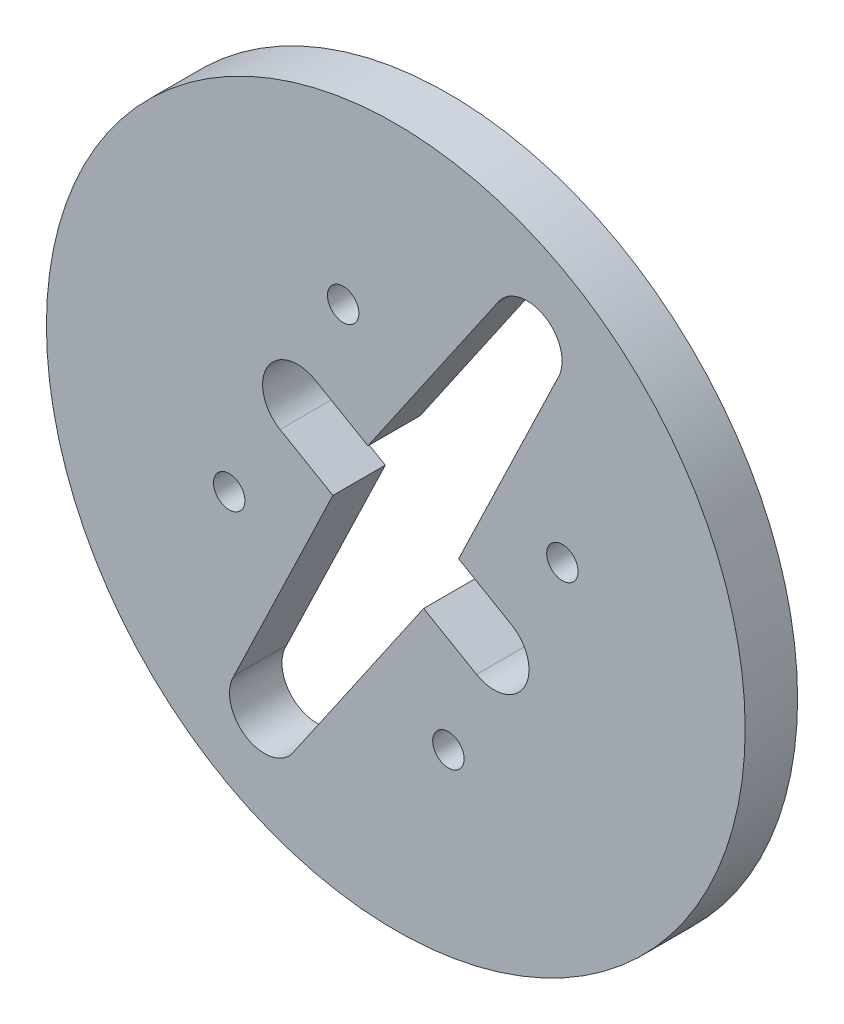
ISO-10303-21;
HEADER;
FILE_DESCRIPTION(('STEP AP214'),'2;1');
FILE_NAME('part.step','',(''),(''),'','','');
FILE_SCHEMA(('AUTOMOTIVE_DESIGN { 1 0 10303 214 1 1 1 1 }'));
ENDSEC;
DATA;
#1=APPLICATION_CONTEXT('core data for automotive mechanical design processes');
#2=APPLICATION_PROTOCOL_DEFINITION('international standard','automotive_design',2000,#1);
#3=PRODUCT_CONTEXT('',#1,'mechanical');
#4=PRODUCT('Part','Part','',(#3));
#5=PRODUCT_RELATED_PRODUCT_CATEGORY('part','',(#4));
#6=PRODUCT_DEFINITION_FORMATION('','',#4);
#7=PRODUCT_DEFINITION_CONTEXT('part definition',#1,'design');
#8=PRODUCT_DEFINITION('design','',#6,#7);
#9=PRODUCT_DEFINITION_SHAPE('','',#8);
#10=(LENGTH_UNIT() NAMED_UNIT(*) SI_UNIT(.MILLI.,.METRE.));
#11=(NAMED_UNIT(*) PLANE_ANGLE_UNIT() SI_UNIT($,.RADIAN.));
#12=(NAMED_UNIT(*) SI_UNIT($,.STERADIAN.) SOLID_ANGLE_UNIT());
#13=UNCERTAINTY_MEASURE_WITH_UNIT(LENGTH_MEASURE(1.E-05),#10,'distance_accuracy_value','');
#14=(GEOMETRIC_REPRESENTATION_CONTEXT(3) GLOBAL_UNCERTAINTY_ASSIGNED_CONTEXT((#13)) GLOBAL_UNIT_ASSIGNED_CONTEXT((#10,
#11,#12)) REPRESENTATION_CONTEXT('',''));
#15=CARTESIAN_POINT('',(0.,0.,0.));
#16=DIRECTION('',(0.,0.,1.));
#17=DIRECTION('',(1.,0.,0.));
#18=AXIS2_PLACEMENT_3D('',#15,#16,#17);
#19=CARTESIAN_POINT('',(2.59213585311026,-1.7801873533811,3.));
#20=DIRECTION('',(0.824324794546752,-0.566117154920654,0.));
#21=DIRECTION('',(0.566117154920654,0.824324794546752,0.));
#22=AXIS2_PLACEMENT_3D('',#19,#20,#21);
#23=PLANE('',#22);
#24=DIRECTION('',(-0.566117154920654,-0.824324794546752,0.));
#25=VECTOR('',#24,1.);
#26=CARTESIAN_POINT('',(2.59213585311026,-1.7801873533811,0.));
#27=LINE('',#26,#25);
#28=CARTESIAN_POINT('',(1.5934941670672,-3.23431234415027,0.));
#29=VERTEX_POINT('',#28);
#30=CARTESIAN_POINT('',(-5.78777046890322,-13.982192710705,0.));
#31=VERTEX_POINT('',#30);
#32=EDGE_CURVE('E160',#29,#31,#27,.T.);
#33=ORIENTED_EDGE('',*,*,#32,.T.);
#34=DIRECTION('',(0.,0.,-1.));
#35=VECTOR('',#34,1.);
#36=CARTESIAN_POINT('',(-5.78777046890322,-13.982192710705,3.));
#37=LINE('',#36,#35);
#38=CARTESIAN_POINT('',(-5.78777046890322,-13.982192710705,3.));
#39=VERTEX_POINT('',#38);
#40=EDGE_CURVE('E11',#39,#31,#37,.T.);
#41=ORIENTED_EDGE('',*,*,#40,.F.);
#42=DIRECTION('',(-0.566117154920654,-0.824324794546752,0.));
#43=VECTOR('',#42,1.);
#44=CARTESIAN_POINT('',(2.59213585311026,-1.7801873533811,3.));
#45=LINE('',#44,#43);
#46=CARTESIAN_POINT('',(1.5934941670672,-3.23431234415027,3.));
#47=VERTEX_POINT('',#46);
#48=EDGE_CURVE('E225',#47,#39,#45,.T.);
#49=ORIENTED_EDGE('',*,*,#48,.F.);
#50=DIRECTION('',(0.,0.,-1.));
#51=VECTOR('',#50,1.);
#52=CARTESIAN_POINT('',(1.5934941670672,-3.23431234415027,3.));
#53=LINE('',#52,#51);
#54=EDGE_CURVE('E49',#47,#29,#53,.T.);
#55=ORIENTED_EDGE('',*,*,#54,.T.);
#56=EDGE_LOOP('',(#33,#41,#49,#55));
#57=FACE_BOUND('',#56,.T.);
#58=ADVANCED_FACE('F32',(#57),#23,.F.);
#59=CARTESIAN_POINT('',(-7.51840234421123,-12.9797390648102,3.));
#60=DIRECTION('',(0.,0.,-1.));
#61=DIRECTION('',(-1.,0.,0.));
#62=AXIS2_PLACEMENT_3D('',#59,#60,#61);
#63=CYLINDRICAL_SURFACE('',#62,2.);
#64=CARTESIAN_POINT('',(-7.51840234421123,-12.9797390648102,0.));
#65=DIRECTION('',(0.,0.,1.));
#66=DIRECTION('',(1.,0.,0.));
#67=AXIS2_PLACEMENT_3D('',#64,#65,#66);
#68=CIRCLE('',#67,2.);
#69=CARTESIAN_POINT('',(-9.24903421951926,-11.9772854189153,0.));
#70=VERTEX_POINT('',#69);
#71=EDGE_CURVE('E163',#31,#70,#68,.F.);
#72=ORIENTED_EDGE('',*,*,#71,.T.);
#73=DIRECTION('',(0.,0.,-1.));
#74=VECTOR('',#73,1.);
#75=CARTESIAN_POINT('',(-9.24903421951926,-11.9772854189153,3.));
#76=LINE('',#75,#74);
#77=CARTESIAN_POINT('',(-9.24903421951926,-11.9772854189153,3.));
#78=VERTEX_POINT('',#77);
#79=EDGE_CURVE('E41',#78,#70,#76,.T.);
#80=ORIENTED_EDGE('',*,*,#79,.F.);
#81=CARTESIAN_POINT('',(-7.51840234421123,-12.9797390648102,3.));
#82=DIRECTION('',(0.,0.,1.));
#83=DIRECTION('',(1.,0.,0.));
#84=AXIS2_PLACEMENT_3D('',#81,#82,#83);
#85=CIRCLE('',#84,2.);
#86=EDGE_CURVE('E99',#39,#78,#85,.F.);
#87=ORIENTED_EDGE('',*,*,#86,.F.);
#88=ORIENTED_EDGE('',*,*,#40,.T.);
#89=EDGE_LOOP('',(#72,#80,#87,#88));
#90=FACE_BOUND('',#89,.T.);
#91=ADVANCED_FACE('F210',(#90),#63,.F.);
#92=CARTESIAN_POINT('',(-2.83390408535548,1.36279966580681,3.));
#93=DIRECTION('',(0.901209479481125,-0.433383749226202,0.));
#94=DIRECTION('',(0.433383749226202,0.901209479481125,0.));
#95=AXIS2_PLACEMENT_3D('',#92,#93,#94);
#96=PLANE('',#95);
#97=DIRECTION('',(-0.433383749226202,-0.901209479481125,0.));
#98=VECTOR('',#97,1.);
#99=CARTESIAN_POINT('',(-2.83390408535548,1.36279966580681,0.));
#100=LINE('',#99,#98);
#101=CARTESIAN_POINT('',(-3.59840145885687,-0.226951406465772,0.));
#102=VERTEX_POINT('',#101);
#103=EDGE_CURVE('E166',#102,#70,#100,.T.);
#104=ORIENTED_EDGE('',*,*,#103,.F.);
#105=DIRECTION('',(0.,0.,-1.));
#106=VECTOR('',#105,1.);
#107=CARTESIAN_POINT('',(-3.59840145885687,-0.226951406465772,3.));
#108=LINE('',#107,#106);
#109=CARTESIAN_POINT('',(-3.59840145885687,-0.226951406465772,3.));
#110=VERTEX_POINT('',#109);
#111=EDGE_CURVE('E203',#110,#102,#108,.T.);
#112=ORIENTED_EDGE('',*,*,#111,.F.);
#113=DIRECTION('',(-0.433383749226202,-0.901209479481125,0.));
#114=VECTOR('',#113,1.);
#115=CARTESIAN_POINT('',(-2.83390408535548,1.36279966580681,3.));
#116=LINE('',#115,#114);
#117=EDGE_CURVE('E209',#110,#78,#116,.T.);
#118=ORIENTED_EDGE('',*,*,#117,.T.);
#119=ORIENTED_EDGE('',*,*,#79,.T.);
#120=EDGE_LOOP('',(#104,#112,#118,#119));
#121=FACE_BOUND('',#120,.T.);
#122=ADVANCED_FACE('F207',(#121),#96,.T.);
#123=CARTESIAN_POINT('',(-1.00245364589483,-1.73063187530802,3.));
#124=DIRECTION('',(0.501226822947415,0.865315937654011,0.));
#125=DIRECTION('',(-0.865315937654011,0.501226822947416,0.));
#126=AXIS2_PLACEMENT_3D('',#123,#124,#125);
#127=PLANE('',#126);
#128=DIRECTION('',(0.865315937654011,-0.501226822947416,0.));
#129=VECTOR('',#128,1.);
#130=CARTESIAN_POINT('',(-1.00245364589483,-1.73063187530802,0.));
#131=LINE('',#130,#129);
#132=CARTESIAN_POINT('',(-6.6270072406459,1.52734247385018,0.));
#133=VERTEX_POINT('',#132);
#134=EDGE_CURVE('E169',#133,#102,#131,.T.);
#135=ORIENTED_EDGE('',*,*,#134,.F.);
#136=DIRECTION('',(0.,0.,-1.));
#137=VECTOR('',#136,1.);
#138=CARTESIAN_POINT('',(-6.6270072406459,1.52734247385018,3.));
#139=LINE('',#138,#137);
#140=CARTESIAN_POINT('',(-6.6270072406459,1.52734247385018,3.));
#141=VERTEX_POINT('',#140);
#142=EDGE_CURVE('E201',#141,#133,#139,.T.);
#143=ORIENTED_EDGE('',*,*,#142,.F.);
#144=DIRECTION('',(0.865315937654011,-0.501226822947416,0.));
#145=VECTOR('',#144,1.);
#146=CARTESIAN_POINT('',(-1.00245364589483,-1.73063187530802,3.));
#147=LINE('',#146,#145);
#148=EDGE_CURVE('E153',#141,#110,#147,.T.);
#149=ORIENTED_EDGE('',*,*,#148,.T.);
#150=ORIENTED_EDGE('',*,*,#111,.T.);
#151=EDGE_LOOP('',(#135,#143,#149,#150));
#152=FACE_BOUND('',#151,.T.);
#153=ADVANCED_FACE('F218',(#152),#127,.T.);
#154=CARTESIAN_POINT('',(-5.62455359475107,3.2579743491582,3.));
#155=DIRECTION('',(0.,0.,-1.));
#156=DIRECTION('',(-1.,0.,0.));
#157=AXIS2_PLACEMENT_3D('',#154,#155,#156);
#158=CYLINDRICAL_SURFACE('',#157,2.);
#159=CARTESIAN_POINT('',(-5.62455359475107,3.2579743491582,0.));
#160=DIRECTION('',(0.,0.,1.));
#161=DIRECTION('',(1.,0.,0.));
#162=AXIS2_PLACEMENT_3D('',#159,#160,#161);
#163=CIRCLE('',#162,2.);
#164=CARTESIAN_POINT('',(-4.62209994885624,4.98860622446622,0.));
#165=VERTEX_POINT('',#164);
#166=EDGE_CURVE('E172',#165,#133,#163,.T.);
#167=ORIENTED_EDGE('',*,*,#166,.F.);
#168=DIRECTION('',(0.,0.,-1.));
#169=VECTOR('',#168,1.);
#170=CARTESIAN_POINT('',(-4.62209994885624,4.98860622446622,3.));
#171=LINE('',#170,#169);
#172=CARTESIAN_POINT('',(-4.62209994885624,4.98860622446622,3.));
#173=VERTEX_POINT('',#172);
#174=EDGE_CURVE('E199',#173,#165,#171,.T.);
#175=ORIENTED_EDGE('',*,*,#174,.F.);
#176=CARTESIAN_POINT('',(-5.62455359475107,3.2579743491582,3.));
#177=DIRECTION('',(0.,0.,1.));
#178=DIRECTION('',(1.,0.,0.));
#179=AXIS2_PLACEMENT_3D('',#176,#177,#178);
#180=CIRCLE('',#179,2.);
#181=EDGE_CURVE('E224',#173,#141,#180,.T.);
#182=ORIENTED_EDGE('',*,*,#181,.T.);
#183=ORIENTED_EDGE('',*,*,#142,.T.);
#184=EDGE_LOOP('',(#167,#175,#182,#183));
#185=FACE_BOUND('',#184,.T.);
#186=ADVANCED_FACE('F307',(#185),#158,.F.);
#187=CARTESIAN_POINT('',(1.00245364589483,1.73063187530802,3.));
#188=DIRECTION('',(0.501226822947415,0.865315937654011,0.));
#189=DIRECTION('',(-0.865315937654011,0.501226822947416,0.));
#190=AXIS2_PLACEMENT_3D('',#187,#188,#189);
#191=PLANE('',#190);
#192=DIRECTION('',(0.865315937654011,-0.501226822947416,0.));
#193=VECTOR('',#192,1.);
#194=CARTESIAN_POINT('',(1.00245364589483,1.73063187530802,0.));
#195=LINE('',#194,#193);
#196=CARTESIAN_POINT('',(-1.5934941670672,3.23431234415027,0.));
#197=VERTEX_POINT('',#196);
#198=EDGE_CURVE('E176',#165,#197,#195,.T.);
#199=ORIENTED_EDGE('',*,*,#198,.T.);
#200=DIRECTION('',(0.,0.,-1.));
#201=VECTOR('',#200,1.);
#202=CARTESIAN_POINT('',(-1.5934941670672,3.23431234415027,3.));
#203=LINE('',#202,#201);
#204=CARTESIAN_POINT('',(-1.5934941670672,3.23431234415027,3.));
#205=VERTEX_POINT('',#204);
#206=EDGE_CURVE('E196',#205,#197,#203,.T.);
#207=ORIENTED_EDGE('',*,*,#206,.F.);
#208=DIRECTION('',(0.865315937654011,-0.501226822947416,0.));
#209=VECTOR('',#208,1.);
#210=CARTESIAN_POINT('',(1.00245364589483,1.73063187530802,3.));
#211=LINE('',#210,#209);
#212=EDGE_CURVE('E139',#173,#205,#211,.T.);
#213=ORIENTED_EDGE('',*,*,#212,.F.);
#214=ORIENTED_EDGE('',*,*,#174,.T.);
#215=EDGE_LOOP('',(#199,#207,#213,#214));
#216=FACE_BOUND('',#215,.T.);
#217=ADVANCED_FACE('F310',(#216),#191,.F.);
#218=CARTESIAN_POINT('',(-2.59213585311026,1.7801873533811,3.));
#219=DIRECTION('',(-0.824324794546752,0.566117154920654,0.));
#220=DIRECTION('',(-0.566117154920654,-0.824324794546752,0.));
#221=AXIS2_PLACEMENT_3D('',#218,#219,#220);
#222=PLANE('',#221);
#223=DIRECTION('',(0.566117154920654,0.824324794546752,0.));
#224=VECTOR('',#223,1.);
#225=CARTESIAN_POINT('',(-2.59213585311026,1.7801873533811,0.));
#226=LINE('',#225,#224);
#227=CARTESIAN_POINT('',(5.78777046890321,13.982192710705,0.));
#228=VERTEX_POINT('',#227);
#229=EDGE_CURVE('E178',#197,#228,#226,.T.);
#230=ORIENTED_EDGE('',*,*,#229,.T.);
#231=DIRECTION('',(0.,0.,-1.));
#232=VECTOR('',#231,1.);
#233=CARTESIAN_POINT('',(5.78777046890321,13.982192710705,3.));
#234=LINE('',#233,#232);
#235=CARTESIAN_POINT('',(5.78777046890321,13.982192710705,3.));
#236=VERTEX_POINT('',#235);
#237=EDGE_CURVE('E194',#236,#228,#234,.T.);
#238=ORIENTED_EDGE('',*,*,#237,.F.);
#239=DIRECTION('',(0.566117154920654,0.824324794546752,0.));
#240=VECTOR('',#239,1.);
#241=CARTESIAN_POINT('',(-2.59213585311026,1.7801873533811,3.));
#242=LINE('',#241,#240);
#243=EDGE_CURVE('E230',#205,#236,#242,.T.);
#244=ORIENTED_EDGE('',*,*,#243,.F.);
#245=ORIENTED_EDGE('',*,*,#206,.T.);
#246=EDGE_LOOP('',(#230,#238,#244,#245));
#247=FACE_BOUND('',#246,.T.);
#248=ADVANCED_FACE('F312',(#247),#222,.F.);
#249=CARTESIAN_POINT('',(7.51840234421123,12.9797390648102,3.));
#250=DIRECTION('',(0.,0.,-1.));
#251=DIRECTION('',(-1.,0.,0.));
#252=AXIS2_PLACEMENT_3D('',#249,#250,#251);
#253=CYLINDRICAL_SURFACE('',#252,2.);
#254=CARTESIAN_POINT('',(7.51840234421123,12.9797390648102,0.));
#255=DIRECTION('',(0.,0.,1.));
#256=DIRECTION('',(1.,0.,0.));
#257=AXIS2_PLACEMENT_3D('',#254,#255,#256);
#258=CIRCLE('',#257,2.);
#259=CARTESIAN_POINT('',(9.24903421951925,11.9772854189153,0.));
#260=VERTEX_POINT('',#259);
#261=EDGE_CURVE('E181',#260,#228,#258,.T.);
#262=ORIENTED_EDGE('',*,*,#261,.F.);
#263=DIRECTION('',(0.,0.,-1.));
#264=VECTOR('',#263,1.);
#265=CARTESIAN_POINT('',(9.24903421951925,11.9772854189153,3.));
#266=LINE('',#265,#264);
#267=CARTESIAN_POINT('',(9.24903421951925,11.9772854189153,3.));
#268=VERTEX_POINT('',#267);
#269=EDGE_CURVE('E192',#268,#260,#266,.T.);
#270=ORIENTED_EDGE('',*,*,#269,.F.);
#271=CARTESIAN_POINT('',(7.51840234421123,12.9797390648102,3.));
#272=DIRECTION('',(0.,0.,1.));
#273=DIRECTION('',(1.,0.,0.));
#274=AXIS2_PLACEMENT_3D('',#271,#272,#273);
#275=CIRCLE('',#274,2.);
#276=EDGE_CURVE('E231',#268,#236,#275,.T.);
#277=ORIENTED_EDGE('',*,*,#276,.T.);
#278=ORIENTED_EDGE('',*,*,#237,.T.);
#279=EDGE_LOOP('',(#262,#270,#277,#278));
#280=FACE_BOUND('',#279,.T.);
#281=ADVANCED_FACE('F315',(#280),#253,.F.);
#282=CARTESIAN_POINT('',(2.83390408535548,-1.36279966580681,3.));
#283=DIRECTION('',(-0.901209479481125,0.433383749226202,0.));
#284=DIRECTION('',(-0.433383749226202,-0.901209479481125,0.));
#285=AXIS2_PLACEMENT_3D('',#282,#283,#284);
#286=PLANE('',#285);
#287=DIRECTION('',(0.433383749226202,0.901209479481125,0.));
#288=VECTOR('',#287,1.);
#289=CARTESIAN_POINT('',(2.83390408535548,-1.36279966580681,0.));
#290=LINE('',#289,#288);
#291=CARTESIAN_POINT('',(3.59840145885686,0.226951406465775,0.));
#292=VERTEX_POINT('',#291);
#293=EDGE_CURVE('E184',#292,#260,#290,.T.);
#294=ORIENTED_EDGE('',*,*,#293,.F.);
#295=DIRECTION('',(0.,0.,-1.));
#296=VECTOR('',#295,1.);
#297=CARTESIAN_POINT('',(3.59840145885686,0.226951406465775,3.));
#298=LINE('',#297,#296);
#299=CARTESIAN_POINT('',(3.59840145885686,0.226951406465775,3.));
#300=VERTEX_POINT('',#299);
#301=EDGE_CURVE('E147',#300,#292,#298,.T.);
#302=ORIENTED_EDGE('',*,*,#301,.F.);
#303=DIRECTION('',(0.433383749226202,0.901209479481125,0.));
#304=VECTOR('',#303,1.);
#305=CARTESIAN_POINT('',(2.83390408535548,-1.36279966580681,3.));
#306=LINE('',#305,#304);
#307=EDGE_CURVE('E136',#300,#268,#306,.T.);
#308=ORIENTED_EDGE('',*,*,#307,.T.);
#309=ORIENTED_EDGE('',*,*,#269,.T.);
#310=EDGE_LOOP('',(#294,#302,#308,#309));
#311=FACE_BOUND('',#310,.T.);
#312=ADVANCED_FACE('F236',(#311),#286,.T.);
#313=CARTESIAN_POINT('',(6.6270072406459,-1.52734247385018,0.));
#314=VERTEX_POINT('',#313);
#315=EDGE_CURVE('E144',#292,#314,#195,.T.);
#316=ORIENTED_EDGE('',*,*,#315,.T.);
#317=DIRECTION('',(0.,0.,-1.));
#318=VECTOR('',#317,1.);
#319=CARTESIAN_POINT('',(6.6270072406459,-1.52734247385018,3.));
#320=LINE('',#319,#318);
#321=CARTESIAN_POINT('',(6.6270072406459,-1.52734247385018,3.));
#322=VERTEX_POINT('',#321);
#323=EDGE_CURVE('E141',#322,#314,#320,.T.);
#324=ORIENTED_EDGE('',*,*,#323,.F.);
#325=EDGE_CURVE('E128',#300,#322,#211,.T.);
#326=ORIENTED_EDGE('',*,*,#325,.F.);
#327=ORIENTED_EDGE('',*,*,#301,.T.);
#328=EDGE_LOOP('',(#316,#324,#326,#327));
#329=FACE_BOUND('',#328,.T.);
#330=ADVANCED_FACE('F142',(#329),#191,.F.);
#331=CARTESIAN_POINT('',(5.62455359475107,-3.2579743491582,3.));
#332=DIRECTION('',(0.,0.,-1.));
#333=DIRECTION('',(-1.,0.,0.));
#334=AXIS2_PLACEMENT_3D('',#331,#332,#333);
#335=CYLINDRICAL_SURFACE('',#334,2.);
#336=CARTESIAN_POINT('',(5.62455359475107,-3.2579743491582,0.));
#337=DIRECTION('',(0.,0.,1.));
#338=DIRECTION('',(1.,0.,0.));
#339=AXIS2_PLACEMENT_3D('',#336,#337,#338);
#340=CIRCLE('',#339,2.);
#341=CARTESIAN_POINT('',(4.62209994885624,-4.98860622446622,0.));
#342=VERTEX_POINT('',#341);
#343=EDGE_CURVE('E187',#342,#314,#340,.T.);
#344=ORIENTED_EDGE('',*,*,#343,.F.);
#345=DIRECTION('',(0.,0.,-1.));
#346=VECTOR('',#345,1.);
#347=CARTESIAN_POINT('',(4.62209994885624,-4.98860622446622,3.));
#348=LINE('',#347,#346);
#349=CARTESIAN_POINT('',(4.62209994885624,-4.98860622446622,3.));
#350=VERTEX_POINT('',#349);
#351=EDGE_CURVE('E87',#350,#342,#348,.T.);
#352=ORIENTED_EDGE('',*,*,#351,.F.);
#353=CARTESIAN_POINT('',(5.62455359475107,-3.2579743491582,3.));
#354=DIRECTION('',(0.,0.,1.));
#355=DIRECTION('',(1.,0.,0.));
#356=AXIS2_PLACEMENT_3D('',#353,#354,#355);
#357=CIRCLE('',#356,2.);
#358=EDGE_CURVE('E133',#350,#322,#357,.T.);
#359=ORIENTED_EDGE('',*,*,#358,.T.);
#360=ORIENTED_EDGE('',*,*,#323,.T.);
#361=EDGE_LOOP('',(#344,#352,#359,#360));
#362=FACE_BOUND('',#361,.T.);
#363=ADVANCED_FACE('F149',(#362),#335,.F.);
#364=CARTESIAN_POINT('',(0.,0.,3.));
#365=DIRECTION('',(0.,0.,-1.));
#366=DIRECTION('',(-1.,0.,0.));
#367=AXIS2_PLACEMENT_3D('',#364,#365,#366);
#368=CYLINDRICAL_SURFACE('',#367,20.);
#369=CARTESIAN_POINT('',(0.,0.,3.));
#370=DIRECTION('',(0.,0.,1.));
#371=DIRECTION('',(1.,0.,0.));
#372=AXIS2_PLACEMENT_3D('',#369,#370,#371);
#373=CIRCLE('',#372,20.);
#374=CARTESIAN_POINT('',(20.,0.,3.));
#375=VERTEX_POINT('',#374);
#376=EDGE_CURVE('E239',#375,#375,#373,.T.);
#377=ORIENTED_EDGE('',*,*,#376,.F.);
#378=EDGE_LOOP('',(#377));
#379=FACE_BOUND('',#378,.T.);
#380=CARTESIAN_POINT('',(0.,0.,0.));
#381=DIRECTION('',(0.,0.,1.));
#382=DIRECTION('',(1.,0.,0.));
#383=AXIS2_PLACEMENT_3D('',#380,#381,#382);
#384=CIRCLE('',#383,20.);
#385=CARTESIAN_POINT('',(20.,0.,0.));
#386=VERTEX_POINT('',#385);
#387=EDGE_CURVE('E157',#386,#386,#384,.T.);
#388=ORIENTED_EDGE('',*,*,#387,.T.);
#389=EDGE_LOOP('',(#388));
#390=FACE_BOUND('',#389,.T.);
#391=ADVANCED_FACE('F34',(#379,#390),#368,.T.);
#392=EDGE_CURVE('E173',#29,#342,#131,.T.);
#393=ORIENTED_EDGE('',*,*,#392,.F.);
#394=ORIENTED_EDGE('',*,*,#54,.F.);
#395=EDGE_CURVE('E150',#47,#350,#147,.T.);
#396=ORIENTED_EDGE('',*,*,#395,.T.);
#397=ORIENTED_EDGE('',*,*,#351,.T.);
#398=EDGE_LOOP('',(#393,#394,#396,#397));
#399=FACE_BOUND('',#398,.T.);
#400=ADVANCED_FACE('F291',(#399),#127,.T.);
#401=CARTESIAN_POINT('',(0.,0.,3.));
#402=DIRECTION('',(0.,0.,1.));
#403=DIRECTION('',(1.,0.,0.));
#404=AXIS2_PLACEMENT_3D('',#401,#402,#403);
#405=PLANE('',#404);
#406=CARTESIAN_POINT('',(3.0112228113094,-9.53585534604263,3.));
#407=DIRECTION('',(0.,0.,-1.));
#408=DIRECTION('',(-1.,0.,0.));
#409=AXIS2_PLACEMENT_3D('',#406,#407,#408);
#410=CIRCLE('',#409,0.9);
#411=CARTESIAN_POINT('',(2.1112228113094,-9.53585534604263,3.));
#412=VERTEX_POINT('',#411);
#413=EDGE_CURVE('E161',#412,#412,#410,.T.);
#414=ORIENTED_EDGE('',*,*,#413,.T.);
#415=EDGE_LOOP('',(#414));
#416=FACE_BOUND('',#415,.T.);
#417=CARTESIAN_POINT('',(9.53585534604263,3.0112228113094,3.));
#418=DIRECTION('',(0.,0.,-1.));
#419=DIRECTION('',(-1.,0.,0.));
#420=AXIS2_PLACEMENT_3D('',#417,#418,#419);
#421=CIRCLE('',#420,0.9);
#422=CARTESIAN_POINT('',(8.63585534604264,3.0112228113094,3.));
#423=VERTEX_POINT('',#422);
#424=EDGE_CURVE('E260',#423,#423,#421,.T.);
#425=ORIENTED_EDGE('',*,*,#424,.T.);
#426=EDGE_LOOP('',(#425));
#427=FACE_BOUND('',#426,.T.);
#428=CARTESIAN_POINT('',(-3.0112228113094,9.53585534604263,3.));
#429=DIRECTION('',(0.,0.,-1.));
#430=DIRECTION('',(-1.,0.,0.));
#431=AXIS2_PLACEMENT_3D('',#428,#429,#430);
#432=CIRCLE('',#431,0.9);
#433=CARTESIAN_POINT('',(-3.9112228113094,9.53585534604263,3.));
#434=VERTEX_POINT('',#433);
#435=EDGE_CURVE('E254',#434,#434,#432,.T.);
#436=ORIENTED_EDGE('',*,*,#435,.T.);
#437=EDGE_LOOP('',(#436));
#438=FACE_BOUND('',#437,.T.);
#439=CARTESIAN_POINT('',(-9.53585534604263,-3.0112228113094,3.));
#440=DIRECTION('',(0.,0.,-1.));
#441=DIRECTION('',(-1.,0.,0.));
#442=AXIS2_PLACEMENT_3D('',#439,#440,#441);
#443=CIRCLE('',#442,0.9);
#444=CARTESIAN_POINT('',(-10.4358553460426,-3.0112228113094,3.));
#445=VERTEX_POINT('',#444);
#446=EDGE_CURVE('E248',#445,#445,#443,.T.);
#447=ORIENTED_EDGE('',*,*,#446,.T.);
#448=EDGE_LOOP('',(#447));
#449=FACE_BOUND('',#448,.T.);
#450=ORIENTED_EDGE('',*,*,#376,.T.);
#451=EDGE_LOOP('',(#450));
#452=FACE_BOUND('',#451,.T.);
#453=ORIENTED_EDGE('',*,*,#48,.T.);
#454=ORIENTED_EDGE('',*,*,#86,.T.);
#455=ORIENTED_EDGE('',*,*,#117,.F.);
#456=ORIENTED_EDGE('',*,*,#148,.F.);
#457=ORIENTED_EDGE('',*,*,#181,.F.);
#458=ORIENTED_EDGE('',*,*,#212,.T.);
#459=ORIENTED_EDGE('',*,*,#243,.T.);
#460=ORIENTED_EDGE('',*,*,#276,.F.);
#461=ORIENTED_EDGE('',*,*,#307,.F.);
#462=ORIENTED_EDGE('',*,*,#325,.T.);
#463=ORIENTED_EDGE('',*,*,#358,.F.);
#464=ORIENTED_EDGE('',*,*,#395,.F.);
#465=EDGE_LOOP('',(#453,#454,#455,#456,#457,#458,#459,#460,#461,#462,#463,#464));
#466=FACE_BOUND('',#465,.T.);
#467=ADVANCED_FACE('F130',(#416,#427,#438,#449,#452,#466),#405,.T.);
#468=CARTESIAN_POINT('',(0.,0.,0.));
#469=DIRECTION('',(0.,0.,1.));
#470=DIRECTION('',(1.,0.,0.));
#471=AXIS2_PLACEMENT_3D('',#468,#469,#470);
#472=PLANE('',#471);
#473=CARTESIAN_POINT('',(3.0112228113094,-9.53585534604263,0.));
#474=DIRECTION('',(0.,0.,-1.));
#475=DIRECTION('',(-1.,0.,0.));
#476=AXIS2_PLACEMENT_3D('',#473,#474,#475);
#477=CIRCLE('',#476,0.9);
#478=CARTESIAN_POINT('',(2.1112228113094,-9.53585534604263,0.));
#479=VERTEX_POINT('',#478);
#480=EDGE_CURVE('E263',#479,#479,#477,.T.);
#481=ORIENTED_EDGE('',*,*,#480,.F.);
#482=EDGE_LOOP('',(#481));
#483=FACE_BOUND('',#482,.T.);
#484=CARTESIAN_POINT('',(9.53585534604263,3.0112228113094,0.));
#485=DIRECTION('',(0.,0.,-1.));
#486=DIRECTION('',(-1.,0.,0.));
#487=AXIS2_PLACEMENT_3D('',#484,#485,#486);
#488=CIRCLE('',#487,0.9);
#489=CARTESIAN_POINT('',(8.63585534604264,3.0112228113094,0.));
#490=VERTEX_POINT('',#489);
#491=EDGE_CURVE('E257',#490,#490,#488,.T.);
#492=ORIENTED_EDGE('',*,*,#491,.F.);
#493=EDGE_LOOP('',(#492));
#494=FACE_BOUND('',#493,.T.);
#495=CARTESIAN_POINT('',(-3.0112228113094,9.53585534604263,0.));
#496=DIRECTION('',(0.,0.,-1.));
#497=DIRECTION('',(-1.,0.,0.));
#498=AXIS2_PLACEMENT_3D('',#495,#496,#497);
#499=CIRCLE('',#498,0.9);
#500=CARTESIAN_POINT('',(-3.9112228113094,9.53585534604263,0.));
#501=VERTEX_POINT('',#500);
#502=EDGE_CURVE('E251',#501,#501,#499,.T.);
#503=ORIENTED_EDGE('',*,*,#502,.F.);
#504=EDGE_LOOP('',(#503));
#505=FACE_BOUND('',#504,.T.);
#506=CARTESIAN_POINT('',(-9.53585534604263,-3.0112228113094,0.));
#507=DIRECTION('',(0.,0.,-1.));
#508=DIRECTION('',(-1.,0.,0.));
#509=AXIS2_PLACEMENT_3D('',#506,#507,#508);
#510=CIRCLE('',#509,0.9);
#511=CARTESIAN_POINT('',(-10.4358553460426,-3.0112228113094,0.));
#512=VERTEX_POINT('',#511);
#513=EDGE_CURVE('E245',#512,#512,#510,.T.);
#514=ORIENTED_EDGE('',*,*,#513,.F.);
#515=EDGE_LOOP('',(#514));
#516=FACE_BOUND('',#515,.T.);
#517=ORIENTED_EDGE('',*,*,#387,.F.);
#518=EDGE_LOOP('',(#517));
#519=FACE_BOUND('',#518,.T.);
#520=ORIENTED_EDGE('',*,*,#32,.F.);
#521=ORIENTED_EDGE('',*,*,#392,.T.);
#522=ORIENTED_EDGE('',*,*,#343,.T.);
#523=ORIENTED_EDGE('',*,*,#315,.F.);
#524=ORIENTED_EDGE('',*,*,#293,.T.);
#525=ORIENTED_EDGE('',*,*,#261,.T.);
#526=ORIENTED_EDGE('',*,*,#229,.F.);
#527=ORIENTED_EDGE('',*,*,#198,.F.);
#528=ORIENTED_EDGE('',*,*,#166,.T.);
#529=ORIENTED_EDGE('',*,*,#134,.T.);
#530=ORIENTED_EDGE('',*,*,#103,.T.);
#531=ORIENTED_EDGE('',*,*,#71,.F.);
#532=EDGE_LOOP('',(#520,#521,#522,#523,#524,#525,#526,#527,#528,#529,#530,#531));
#533=FACE_BOUND('',#532,.T.);
#534=ADVANCED_FACE('F213',(#483,#494,#505,#516,#519,#533),#472,.F.);
#535=CARTESIAN_POINT('',(-9.53585534604263,-3.0112228113094,3.));
#536=DIRECTION('',(0.,0.,-1.));
#537=DIRECTION('',(-1.,0.,0.));
#538=AXIS2_PLACEMENT_3D('',#535,#536,#537);
#539=CYLINDRICAL_SURFACE('',#538,0.9);
#540=ORIENTED_EDGE('',*,*,#446,.F.);
#541=EDGE_LOOP('',(#540));
#542=FACE_BOUND('',#541,.T.);
#543=ORIENTED_EDGE('',*,*,#513,.T.);
#544=EDGE_LOOP('',(#543));
#545=FACE_BOUND('',#544,.T.);
#546=ADVANCED_FACE('F280',(#542,#545),#539,.F.);
#547=CARTESIAN_POINT('',(-3.0112228113094,9.53585534604263,3.));
#548=DIRECTION('',(0.,0.,-1.));
#549=DIRECTION('',(-1.,0.,0.));
#550=AXIS2_PLACEMENT_3D('',#547,#548,#549);
#551=CYLINDRICAL_SURFACE('',#550,0.9);
#552=ORIENTED_EDGE('',*,*,#435,.F.);
#553=EDGE_LOOP('',(#552));
#554=FACE_BOUND('',#553,.T.);
#555=ORIENTED_EDGE('',*,*,#502,.T.);
#556=EDGE_LOOP('',(#555));
#557=FACE_BOUND('',#556,.T.);
#558=ADVANCED_FACE('F327',(#554,#557),#551,.F.);
#559=CARTESIAN_POINT('',(9.53585534604263,3.0112228113094,3.));
#560=DIRECTION('',(0.,0.,-1.));
#561=DIRECTION('',(-1.,0.,0.));
#562=AXIS2_PLACEMENT_3D('',#559,#560,#561);
#563=CYLINDRICAL_SURFACE('',#562,0.9);
#564=ORIENTED_EDGE('',*,*,#424,.F.);
#565=EDGE_LOOP('',(#564));
#566=FACE_BOUND('',#565,.T.);
#567=ORIENTED_EDGE('',*,*,#491,.T.);
#568=EDGE_LOOP('',(#567));
#569=FACE_BOUND('',#568,.T.);
#570=ADVANCED_FACE('F274',(#566,#569),#563,.F.);
#571=CARTESIAN_POINT('',(3.0112228113094,-9.53585534604263,3.));
#572=DIRECTION('',(0.,0.,-1.));
#573=DIRECTION('',(-1.,0.,0.));
#574=AXIS2_PLACEMENT_3D('',#571,#572,#573);
#575=CYLINDRICAL_SURFACE('',#574,0.9);
#576=ORIENTED_EDGE('',*,*,#413,.F.);
#577=EDGE_LOOP('',(#576));
#578=FACE_BOUND('',#577,.T.);
#579=ORIENTED_EDGE('',*,*,#480,.T.);
#580=EDGE_LOOP('',(#579));
#581=FACE_BOUND('',#580,.T.);
#582=ADVANCED_FACE('F271',(#578,#581),#575,.F.);
#583=CLOSED_SHELL('',(#58,#91,#122,#153,#186,#217,#248,#281,#312,#330,#363,#391,#400,#467,#534,
#546,#558,#570,#582));
#584=MANIFOLD_SOLID_BREP('B2',#583);
#585=ADVANCED_BREP_SHAPE_REPRESENTATION('',(#18,#584),#14);
#586=SHAPE_DEFINITION_REPRESENTATION(#9,#585);
ENDSEC;
END-ISO-10303-21;
